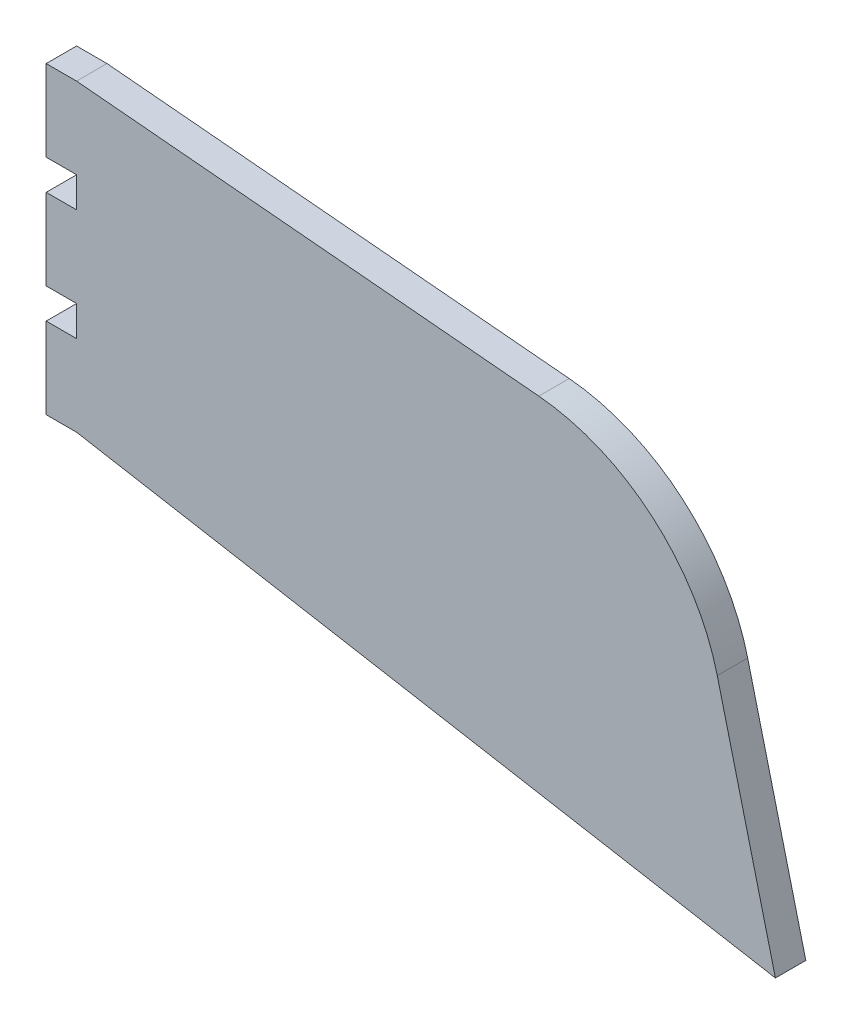
ISO-10303-21;
HEADER;
FILE_DESCRIPTION(('STEP AP214'),'2;1');
FILE_NAME('part.step','',(''),(''),'','','');
FILE_SCHEMA(('AUTOMOTIVE_DESIGN { 1 0 10303 214 1 1 1 1 }'));
ENDSEC;
DATA;
#1=APPLICATION_CONTEXT('core data for automotive mechanical design processes');
#2=APPLICATION_PROTOCOL_DEFINITION('international standard','automotive_design',2000,#1);
#3=PRODUCT_CONTEXT('',#1,'mechanical');
#4=PRODUCT('Part','Part','',(#3));
#5=PRODUCT_RELATED_PRODUCT_CATEGORY('part','',(#4));
#6=PRODUCT_DEFINITION_FORMATION('','',#4);
#7=PRODUCT_DEFINITION_CONTEXT('part definition',#1,'design');
#8=PRODUCT_DEFINITION('design','',#6,#7);
#9=PRODUCT_DEFINITION_SHAPE('','',#8);
#10=(LENGTH_UNIT() NAMED_UNIT(*) SI_UNIT(.MILLI.,.METRE.));
#11=(NAMED_UNIT(*) PLANE_ANGLE_UNIT() SI_UNIT($,.RADIAN.));
#12=(NAMED_UNIT(*) SI_UNIT($,.STERADIAN.) SOLID_ANGLE_UNIT());
#13=UNCERTAINTY_MEASURE_WITH_UNIT(LENGTH_MEASURE(1.E-05),#10,'distance_accuracy_value','');
#14=(GEOMETRIC_REPRESENTATION_CONTEXT(3) GLOBAL_UNCERTAINTY_ASSIGNED_CONTEXT((#13)) GLOBAL_UNIT_ASSIGNED_CONTEXT((#10,
#11,#12)) REPRESENTATION_CONTEXT('',''));
#15=CARTESIAN_POINT('',(0.,0.,0.));
#16=DIRECTION('',(0.,0.,1.));
#17=DIRECTION('',(1.,0.,0.));
#18=AXIS2_PLACEMENT_3D('',#15,#16,#17);
#19=CARTESIAN_POINT('',(3.21481707883157,35.6487339708589,3.));
#20=DIRECTION('',(0.0898159250307489,0.995958382469303,0.));
#21=DIRECTION('',(-0.995958382469303,0.0898159250307489,0.));
#22=AXIS2_PLACEMENT_3D('',#19,#20,#21);
#23=PLANE('',#22);
#24=DIRECTION('',(0.995958382469303,-0.0898159250307489,0.));
#25=VECTOR('',#24,1.);
#26=CARTESIAN_POINT('',(3.21481707883157,35.6487339708589,3.));
#27=LINE('',#26,#25);
#28=CARTESIAN_POINT('',(-68.9365427108545,42.1553724366853,3.));
#29=VERTEX_POINT('',#28);
#30=CARTESIAN_POINT('',(-23.3424878666364,38.0436823461987,3.));
#31=VERTEX_POINT('',#30);
#32=EDGE_CURVE('E146',#29,#31,#27,.T.);
#33=ORIENTED_EDGE('',*,*,#32,.T.);
#34=DIRECTION('',(0.,0.,-1.));
#35=VECTOR('',#34,1.);
#36=CARTESIAN_POINT('',(-23.3424878666364,38.0436823461987,3.));
#37=LINE('',#36,#35);
#38=CARTESIAN_POINT('',(-23.3424878666364,38.0436823461987,0.));
#39=VERTEX_POINT('',#38);
#40=EDGE_CURVE('E151',#31,#39,#37,.T.);
#41=ORIENTED_EDGE('',*,*,#40,.T.);
#42=DIRECTION('',(0.995958382469303,-0.0898159250307489,0.));
#43=VECTOR('',#42,1.);
#44=CARTESIAN_POINT('',(3.21481707883157,35.6487339708589,0.));
#45=LINE('',#44,#43);
#46=CARTESIAN_POINT('',(-68.9365427108545,42.1553724366853,0.));
#47=VERTEX_POINT('',#46);
#48=EDGE_CURVE('E148',#47,#39,#45,.T.);
#49=ORIENTED_EDGE('',*,*,#48,.F.);
#50=DIRECTION('',(0.,0.,-1.));
#51=VECTOR('',#50,1.);
#52=CARTESIAN_POINT('',(-68.9365427108545,42.1553724366853,3.));
#53=LINE('',#52,#51);
#54=EDGE_CURVE('E142',#29,#47,#53,.T.);
#55=ORIENTED_EDGE('',*,*,#54,.F.);
#56=EDGE_LOOP('',(#33,#41,#49,#55));
#57=FACE_BOUND('',#56,.T.);
#58=ADVANCED_FACE('F37',(#57),#23,.T.);
#59=CARTESIAN_POINT('',(0.,42.1553724366855,3.));
#60=DIRECTION('',(0.,-1.,0.));
#61=DIRECTION('',(1.,0.,0.));
#62=AXIS2_PLACEMENT_3D('',#59,#60,#61);
#63=PLANE('',#62);
#64=DIRECTION('',(-1.,0.,0.));
#65=VECTOR('',#64,1.);
#66=CARTESIAN_POINT('',(0.,42.1553724366855,0.));
#67=LINE('',#66,#65);
#68=CARTESIAN_POINT('',(-71.9365427108545,42.1553724366853,0.));
#69=VERTEX_POINT('',#68);
#70=EDGE_CURVE('E198',#47,#69,#67,.T.);
#71=ORIENTED_EDGE('',*,*,#70,.T.);
#72=DIRECTION('',(0.,0.,-1.));
#73=VECTOR('',#72,1.);
#74=CARTESIAN_POINT('',(-71.9365427108545,42.1553724366853,3.));
#75=LINE('',#74,#73);
#76=CARTESIAN_POINT('',(-71.9365427108545,42.1553724366853,3.));
#77=VERTEX_POINT('',#76);
#78=EDGE_CURVE('E152',#77,#69,#75,.T.);
#79=ORIENTED_EDGE('',*,*,#78,.F.);
#80=DIRECTION('',(-1.,0.,0.));
#81=VECTOR('',#80,1.);
#82=CARTESIAN_POINT('',(0.,42.1553724366855,3.));
#83=LINE('',#82,#81);
#84=EDGE_CURVE('E155',#29,#77,#83,.T.);
#85=ORIENTED_EDGE('',*,*,#84,.F.);
#86=ORIENTED_EDGE('',*,*,#54,.T.);
#87=EDGE_LOOP('',(#71,#79,#85,#86));
#88=FACE_BOUND('',#87,.T.);
#89=ADVANCED_FACE('F156',(#88),#63,.F.);
#90=CARTESIAN_POINT('',(-71.9365427108545,0.,3.));
#91=DIRECTION('',(1.,0.,0.));
#92=DIRECTION('',(0.,0.,-1.));
#93=AXIS2_PLACEMENT_3D('',#90,#91,#92);
#94=PLANE('',#93);
#95=DIRECTION('',(0.,-1.,0.));
#96=VECTOR('',#95,1.);
#97=CARTESIAN_POINT('',(-71.9365427108545,0.,0.));
#98=LINE('',#97,#96);
#99=CARTESIAN_POINT('',(-71.9365427108545,34.1553724366853,0.));
#100=VERTEX_POINT('',#99);
#101=EDGE_CURVE('E200',#69,#100,#98,.T.);
#102=ORIENTED_EDGE('',*,*,#101,.T.);
#103=DIRECTION('',(0.,0.,-1.));
#104=VECTOR('',#103,1.);
#105=CARTESIAN_POINT('',(-71.9365427108545,34.1553724366853,3.));
#106=LINE('',#105,#104);
#107=CARTESIAN_POINT('',(-71.9365427108545,34.1553724366853,3.));
#108=VERTEX_POINT('',#107);
#109=EDGE_CURVE('E251',#108,#100,#106,.T.);
#110=ORIENTED_EDGE('',*,*,#109,.F.);
#111=DIRECTION('',(0.,-1.,0.));
#112=VECTOR('',#111,1.);
#113=CARTESIAN_POINT('',(-71.9365427108545,0.,3.));
#114=LINE('',#113,#112);
#115=EDGE_CURVE('E160',#77,#108,#114,.T.);
#116=ORIENTED_EDGE('',*,*,#115,.F.);
#117=ORIENTED_EDGE('',*,*,#78,.T.);
#118=EDGE_LOOP('',(#102,#110,#116,#117));
#119=FACE_BOUND('',#118,.T.);
#120=ADVANCED_FACE('F259',(#119),#94,.F.);
#121=CARTESIAN_POINT('',(0.,34.1553724366853,3.));
#122=DIRECTION('',(0.,-1.,0.));
#123=DIRECTION('',(0.,0.,-1.));
#124=AXIS2_PLACEMENT_3D('',#121,#122,#123);
#125=PLANE('',#124);
#126=DIRECTION('',(-1.,0.,0.));
#127=VECTOR('',#126,1.);
#128=CARTESIAN_POINT('',(0.,34.1553724366853,0.));
#129=LINE('',#128,#127);
#130=CARTESIAN_POINT('',(-68.9365427108545,34.1553724366853,0.));
#131=VERTEX_POINT('',#130);
#132=EDGE_CURVE('E203',#131,#100,#129,.T.);
#133=ORIENTED_EDGE('',*,*,#132,.F.);
#134=DIRECTION('',(0.,0.,-1.));
#135=VECTOR('',#134,1.);
#136=CARTESIAN_POINT('',(-68.9365427108545,34.1553724366853,3.));
#137=LINE('',#136,#135);
#138=CARTESIAN_POINT('',(-68.9365427108545,34.1553724366853,3.));
#139=VERTEX_POINT('',#138);
#140=EDGE_CURVE('E249',#139,#131,#137,.T.);
#141=ORIENTED_EDGE('',*,*,#140,.F.);
#142=DIRECTION('',(-1.,0.,0.));
#143=VECTOR('',#142,1.);
#144=CARTESIAN_POINT('',(0.,34.1553724366853,3.));
#145=LINE('',#144,#143);
#146=EDGE_CURVE('E170',#139,#108,#145,.T.);
#147=ORIENTED_EDGE('',*,*,#146,.T.);
#148=ORIENTED_EDGE('',*,*,#109,.T.);
#149=EDGE_LOOP('',(#133,#141,#147,#148));
#150=FACE_BOUND('',#149,.T.);
#151=ADVANCED_FACE('F266',(#150),#125,.T.);
#152=CARTESIAN_POINT('',(-68.9365427108545,0.,3.));
#153=DIRECTION('',(1.,0.,0.));
#154=DIRECTION('',(0.,0.,-1.));
#155=AXIS2_PLACEMENT_3D('',#152,#153,#154);
#156=PLANE('',#155);
#157=DIRECTION('',(0.,-1.,0.));
#158=VECTOR('',#157,1.);
#159=CARTESIAN_POINT('',(-68.9365427108545,0.,0.));
#160=LINE('',#159,#158);
#161=CARTESIAN_POINT('',(-68.9365427108545,31.1553724366853,0.));
#162=VERTEX_POINT('',#161);
#163=EDGE_CURVE('E206',#131,#162,#160,.T.);
#164=ORIENTED_EDGE('',*,*,#163,.T.);
#165=DIRECTION('',(0.,0.,-1.));
#166=VECTOR('',#165,1.);
#167=CARTESIAN_POINT('',(-68.9365427108545,31.1553724366853,3.));
#168=LINE('',#167,#166);
#169=CARTESIAN_POINT('',(-68.9365427108545,31.1553724366853,3.));
#170=VERTEX_POINT('',#169);
#171=EDGE_CURVE('E246',#170,#162,#168,.T.);
#172=ORIENTED_EDGE('',*,*,#171,.F.);
#173=DIRECTION('',(0.,-1.,0.));
#174=VECTOR('',#173,1.);
#175=CARTESIAN_POINT('',(-68.9365427108545,0.,3.));
#176=LINE('',#175,#174);
#177=EDGE_CURVE('E173',#139,#170,#176,.T.);
#178=ORIENTED_EDGE('',*,*,#177,.F.);
#179=ORIENTED_EDGE('',*,*,#140,.T.);
#180=EDGE_LOOP('',(#164,#172,#178,#179));
#181=FACE_BOUND('',#180,.T.);
#182=ADVANCED_FACE('F269',(#181),#156,.F.);
#183=CARTESIAN_POINT('',(0.,31.1553724366853,3.));
#184=DIRECTION('',(0.,-1.,0.));
#185=DIRECTION('',(0.,0.,-1.));
#186=AXIS2_PLACEMENT_3D('',#183,#184,#185);
#187=PLANE('',#186);
#188=DIRECTION('',(-1.,0.,0.));
#189=VECTOR('',#188,1.);
#190=CARTESIAN_POINT('',(0.,31.1553724366853,0.));
#191=LINE('',#190,#189);
#192=CARTESIAN_POINT('',(-71.9365427108545,31.1553724366853,0.));
#193=VERTEX_POINT('',#192);
#194=EDGE_CURVE('E208',#162,#193,#191,.T.);
#195=ORIENTED_EDGE('',*,*,#194,.T.);
#196=DIRECTION('',(0.,0.,-1.));
#197=VECTOR('',#196,1.);
#198=CARTESIAN_POINT('',(-71.9365427108545,31.1553724366853,3.));
#199=LINE('',#198,#197);
#200=CARTESIAN_POINT('',(-71.9365427108545,31.1553724366853,3.));
#201=VERTEX_POINT('',#200);
#202=EDGE_CURVE('E243',#201,#193,#199,.T.);
#203=ORIENTED_EDGE('',*,*,#202,.F.);
#204=DIRECTION('',(-1.,0.,0.));
#205=VECTOR('',#204,1.);
#206=CARTESIAN_POINT('',(0.,31.1553724366853,3.));
#207=LINE('',#206,#205);
#208=EDGE_CURVE('E175',#170,#201,#207,.T.);
#209=ORIENTED_EDGE('',*,*,#208,.F.);
#210=ORIENTED_EDGE('',*,*,#171,.T.);
#211=EDGE_LOOP('',(#195,#203,#209,#210));
#212=FACE_BOUND('',#211,.T.);
#213=ADVANCED_FACE('F274',(#212),#187,.F.);
#214=CARTESIAN_POINT('',(-71.9365427108545,0.,3.));
#215=DIRECTION('',(1.,0.,0.));
#216=DIRECTION('',(0.,0.,-1.));
#217=AXIS2_PLACEMENT_3D('',#214,#215,#216);
#218=PLANE('',#217);
#219=DIRECTION('',(0.,-1.,0.));
#220=VECTOR('',#219,1.);
#221=CARTESIAN_POINT('',(-71.9365427108545,0.,0.));
#222=LINE('',#221,#220);
#223=CARTESIAN_POINT('',(-71.9365427108545,23.1553724366853,0.));
#224=VERTEX_POINT('',#223);
#225=EDGE_CURVE('E211',#193,#224,#222,.T.);
#226=ORIENTED_EDGE('',*,*,#225,.T.);
#227=DIRECTION('',(0.,0.,-1.));
#228=VECTOR('',#227,1.);
#229=CARTESIAN_POINT('',(-71.9365427108545,23.1553724366853,3.));
#230=LINE('',#229,#228);
#231=CARTESIAN_POINT('',(-71.9365427108545,23.1553724366853,3.));
#232=VERTEX_POINT('',#231);
#233=EDGE_CURVE('E241',#232,#224,#230,.T.);
#234=ORIENTED_EDGE('',*,*,#233,.F.);
#235=DIRECTION('',(0.,-1.,0.));
#236=VECTOR('',#235,1.);
#237=CARTESIAN_POINT('',(-71.9365427108545,0.,3.));
#238=LINE('',#237,#236);
#239=EDGE_CURVE('E178',#201,#232,#238,.T.);
#240=ORIENTED_EDGE('',*,*,#239,.F.);
#241=ORIENTED_EDGE('',*,*,#202,.T.);
#242=EDGE_LOOP('',(#226,#234,#240,#241));
#243=FACE_BOUND('',#242,.T.);
#244=ADVANCED_FACE('F279',(#243),#218,.F.);
#245=CARTESIAN_POINT('',(0.,23.1553724366854,3.));
#246=DIRECTION('',(0.,-1.,0.));
#247=DIRECTION('',(1.,0.,0.));
#248=AXIS2_PLACEMENT_3D('',#245,#246,#247);
#249=PLANE('',#248);
#250=DIRECTION('',(-1.,0.,0.));
#251=VECTOR('',#250,1.);
#252=CARTESIAN_POINT('',(0.,23.1553724366854,0.));
#253=LINE('',#252,#251);
#254=CARTESIAN_POINT('',(-68.9365427108545,23.1553724366853,0.));
#255=VERTEX_POINT('',#254);
#256=EDGE_CURVE('E214',#255,#224,#253,.T.);
#257=ORIENTED_EDGE('',*,*,#256,.F.);
#258=DIRECTION('',(0.,0.,-1.));
#259=VECTOR('',#258,1.);
#260=CARTESIAN_POINT('',(-68.9365427108545,23.1553724366853,3.));
#261=LINE('',#260,#259);
#262=CARTESIAN_POINT('',(-68.9365427108545,23.1553724366853,3.));
#263=VERTEX_POINT('',#262);
#264=EDGE_CURVE('E239',#263,#255,#261,.T.);
#265=ORIENTED_EDGE('',*,*,#264,.F.);
#266=DIRECTION('',(-1.,0.,0.));
#267=VECTOR('',#266,1.);
#268=CARTESIAN_POINT('',(0.,23.1553724366854,3.));
#269=LINE('',#268,#267);
#270=EDGE_CURVE('E180',#263,#232,#269,.T.);
#271=ORIENTED_EDGE('',*,*,#270,.T.);
#272=ORIENTED_EDGE('',*,*,#233,.T.);
#273=EDGE_LOOP('',(#257,#265,#271,#272));
#274=FACE_BOUND('',#273,.T.);
#275=ADVANCED_FACE('F283',(#274),#249,.T.);
#276=CARTESIAN_POINT('',(-68.9365427108545,20.1553724366853,0.));
#277=VERTEX_POINT('',#276);
#278=EDGE_CURVE('E209',#255,#277,#160,.T.);
#279=ORIENTED_EDGE('',*,*,#278,.T.);
#280=DIRECTION('',(0.,0.,-1.));
#281=VECTOR('',#280,1.);
#282=CARTESIAN_POINT('',(-68.9365427108545,20.1553724366853,3.));
#283=LINE('',#282,#281);
#284=CARTESIAN_POINT('',(-68.9365427108545,20.1553724366853,3.));
#285=VERTEX_POINT('',#284);
#286=EDGE_CURVE('E236',#285,#277,#283,.T.);
#287=ORIENTED_EDGE('',*,*,#286,.F.);
#288=EDGE_CURVE('E176',#263,#285,#176,.T.);
#289=ORIENTED_EDGE('',*,*,#288,.F.);
#290=ORIENTED_EDGE('',*,*,#264,.T.);
#291=EDGE_LOOP('',(#279,#287,#289,#290));
#292=FACE_BOUND('',#291,.T.);
#293=ADVANCED_FACE('F288',(#292),#156,.F.);
#294=CARTESIAN_POINT('',(0.,20.1553724366854,3.));
#295=DIRECTION('',(0.,-1.,0.));
#296=DIRECTION('',(1.,0.,0.));
#297=AXIS2_PLACEMENT_3D('',#294,#295,#296);
#298=PLANE('',#297);
#299=DIRECTION('',(-1.,0.,0.));
#300=VECTOR('',#299,1.);
#301=CARTESIAN_POINT('',(0.,20.1553724366854,0.));
#302=LINE('',#301,#300);
#303=CARTESIAN_POINT('',(-71.9365427108545,20.1553724366853,0.));
#304=VERTEX_POINT('',#303);
#305=EDGE_CURVE('E217',#277,#304,#302,.T.);
#306=ORIENTED_EDGE('',*,*,#305,.T.);
#307=DIRECTION('',(0.,0.,-1.));
#308=VECTOR('',#307,1.);
#309=CARTESIAN_POINT('',(-71.9365427108545,20.1553724366853,3.));
#310=LINE('',#309,#308);
#311=CARTESIAN_POINT('',(-71.9365427108545,20.1553724366853,3.));
#312=VERTEX_POINT('',#311);
#313=EDGE_CURVE('E234',#312,#304,#310,.T.);
#314=ORIENTED_EDGE('',*,*,#313,.F.);
#315=DIRECTION('',(-1.,0.,0.));
#316=VECTOR('',#315,1.);
#317=CARTESIAN_POINT('',(0.,20.1553724366854,3.));
#318=LINE('',#317,#316);
#319=EDGE_CURVE('E183',#285,#312,#318,.T.);
#320=ORIENTED_EDGE('',*,*,#319,.F.);
#321=ORIENTED_EDGE('',*,*,#286,.T.);
#322=EDGE_LOOP('',(#306,#314,#320,#321));
#323=FACE_BOUND('',#322,.T.);
#324=ADVANCED_FACE('F294',(#323),#298,.F.);
#325=CARTESIAN_POINT('',(-71.9365427108545,0.,3.));
#326=DIRECTION('',(-1.,0.,0.));
#327=DIRECTION('',(0.,0.,1.));
#328=AXIS2_PLACEMENT_3D('',#325,#326,#327);
#329=PLANE('',#328);
#330=DIRECTION('',(0.,1.,0.));
#331=VECTOR('',#330,1.);
#332=CARTESIAN_POINT('',(-71.9365427108545,0.,0.));
#333=LINE('',#332,#331);
#334=CARTESIAN_POINT('',(-71.9365427108545,12.1553724366853,0.));
#335=VERTEX_POINT('',#334);
#336=EDGE_CURVE('E220',#335,#304,#333,.T.);
#337=ORIENTED_EDGE('',*,*,#336,.F.);
#338=DIRECTION('',(0.,0.,-1.));
#339=VECTOR('',#338,1.);
#340=CARTESIAN_POINT('',(-71.9365427108545,12.1553724366853,3.));
#341=LINE('',#340,#339);
#342=CARTESIAN_POINT('',(-71.9365427108545,12.1553724366853,3.));
#343=VERTEX_POINT('',#342);
#344=EDGE_CURVE('E232',#343,#335,#341,.T.);
#345=ORIENTED_EDGE('',*,*,#344,.F.);
#346=DIRECTION('',(0.,1.,0.));
#347=VECTOR('',#346,1.);
#348=CARTESIAN_POINT('',(-71.9365427108545,0.,3.));
#349=LINE('',#348,#347);
#350=EDGE_CURVE('E185',#343,#312,#349,.T.);
#351=ORIENTED_EDGE('',*,*,#350,.T.);
#352=ORIENTED_EDGE('',*,*,#313,.T.);
#353=EDGE_LOOP('',(#337,#345,#351,#352));
#354=FACE_BOUND('',#353,.T.);
#355=ADVANCED_FACE('F298',(#354),#329,.T.);
#356=CARTESIAN_POINT('',(0.,12.1553724366855,3.));
#357=DIRECTION('',(0.,-1.,0.));
#358=DIRECTION('',(1.,0.,0.));
#359=AXIS2_PLACEMENT_3D('',#356,#357,#358);
#360=PLANE('',#359);
#361=DIRECTION('',(-1.,0.,0.));
#362=VECTOR('',#361,1.);
#363=CARTESIAN_POINT('',(0.,12.1553724366855,0.));
#364=LINE('',#363,#362);
#365=CARTESIAN_POINT('',(-68.9365427108545,12.1553724366853,0.));
#366=VERTEX_POINT('',#365);
#367=EDGE_CURVE('E223',#366,#335,#364,.T.);
#368=ORIENTED_EDGE('',*,*,#367,.F.);
#369=DIRECTION('',(0.,0.,-1.));
#370=VECTOR('',#369,1.);
#371=CARTESIAN_POINT('',(-68.9365427108545,12.1553724366853,3.));
#372=LINE('',#371,#370);
#373=CARTESIAN_POINT('',(-68.9365427108545,12.1553724366853,3.));
#374=VERTEX_POINT('',#373);
#375=EDGE_CURVE('E230',#374,#366,#372,.T.);
#376=ORIENTED_EDGE('',*,*,#375,.F.);
#377=DIRECTION('',(-1.,0.,0.));
#378=VECTOR('',#377,1.);
#379=CARTESIAN_POINT('',(0.,12.1553724366855,3.));
#380=LINE('',#379,#378);
#381=EDGE_CURVE('E188',#374,#343,#380,.T.);
#382=ORIENTED_EDGE('',*,*,#381,.T.);
#383=ORIENTED_EDGE('',*,*,#344,.T.);
#384=EDGE_LOOP('',(#368,#376,#382,#383));
#385=FACE_BOUND('',#384,.T.);
#386=ADVANCED_FACE('F301',(#385),#360,.T.);
#387=CARTESIAN_POINT('',(0.,0.,3.));
#388=DIRECTION('',(0.173648177666933,0.984807753012207,0.));
#389=DIRECTION('',(-0.984807753012208,0.173648177666933,0.));
#390=AXIS2_PLACEMENT_3D('',#387,#388,#389);
#391=PLANE('',#390);
#392=DIRECTION('',(0.984807753012208,-0.173648177666933,0.));
#393=VECTOR('',#392,1.);
#394=CARTESIAN_POINT('',(0.,0.,0.));
#395=LINE('',#394,#393);
#396=CARTESIAN_POINT('',(0.,0.,0.));
#397=VERTEX_POINT('',#396);
#398=EDGE_CURVE('E166',#366,#397,#395,.T.);
#399=ORIENTED_EDGE('',*,*,#398,.T.);
#400=DIRECTION('',(0.,0.,-1.));
#401=VECTOR('',#400,1.);
#402=CARTESIAN_POINT('',(0.,0.,3.));
#403=LINE('',#402,#401);
#404=CARTESIAN_POINT('',(0.,0.,3.));
#405=VERTEX_POINT('',#404);
#406=EDGE_CURVE('E196',#405,#397,#403,.T.);
#407=ORIENTED_EDGE('',*,*,#406,.F.);
#408=DIRECTION('',(0.984807753012208,-0.173648177666933,0.));
#409=VECTOR('',#408,1.);
#410=CARTESIAN_POINT('',(0.,0.,3.));
#411=LINE('',#410,#409);
#412=EDGE_CURVE('E191',#374,#405,#411,.T.);
#413=ORIENTED_EDGE('',*,*,#412,.F.);
#414=ORIENTED_EDGE('',*,*,#375,.T.);
#415=EDGE_LOOP('',(#399,#407,#413,#414));
#416=FACE_BOUND('',#415,.T.);
#417=ADVANCED_FACE('F305',(#416),#391,.F.);
#418=CARTESIAN_POINT('',(0.,0.,3.));
#419=DIRECTION('',(0.970220464290268,0.242223555155926,0.));
#420=DIRECTION('',(-0.242223555155926,0.970220464290269,0.));
#421=AXIS2_PLACEMENT_3D('',#418,#419,#420);
#422=PLANE('',#421);
#423=DIRECTION('',(0.242223555155926,-0.970220464290269,0.));
#424=VECTOR('',#423,1.);
#425=CARTESIAN_POINT('',(0.,0.,0.));
#426=LINE('',#425,#424);
#427=CARTESIAN_POINT('',(-5.734397081446,22.9689857999312,0.));
#428=VERTEX_POINT('',#427);
#429=EDGE_CURVE('E164',#428,#397,#426,.T.);
#430=ORIENTED_EDGE('',*,*,#429,.F.);
#431=DIRECTION('',(0.,0.,-1.));
#432=VECTOR('',#431,1.);
#433=CARTESIAN_POINT('',(-5.734397081446,22.9689857999311,3.));
#434=LINE('',#433,#432);
#435=CARTESIAN_POINT('',(-5.734397081446,22.9689857999312,3.));
#436=VERTEX_POINT('',#435);
#437=EDGE_CURVE('E45',#428,#436,#434,.F.);
#438=ORIENTED_EDGE('',*,*,#437,.T.);
#439=DIRECTION('',(0.242223555155926,-0.970220464290269,0.));
#440=VECTOR('',#439,1.);
#441=CARTESIAN_POINT('',(0.,0.,3.));
#442=LINE('',#441,#440);
#443=EDGE_CURVE('E194',#436,#405,#442,.T.);
#444=ORIENTED_EDGE('',*,*,#443,.T.);
#445=ORIENTED_EDGE('',*,*,#406,.T.);
#446=EDGE_LOOP('',(#430,#438,#444,#445));
#447=FACE_BOUND('',#446,.T.);
#448=ADVANCED_FACE('F307',(#447),#422,.T.);
#449=CARTESIAN_POINT('',(0.,0.,3.));
#450=DIRECTION('',(0.,0.,1.));
#451=DIRECTION('',(1.,0.,0.));
#452=AXIS2_PLACEMENT_3D('',#449,#450,#451);
#453=PLANE('',#452);
#454=ORIENTED_EDGE('',*,*,#443,.F.);
#455=CARTESIAN_POINT('',(-25.1388063672514,18.1245146968126,3.));
#456=DIRECTION('',(0.,0.,1.));
#457=DIRECTION('',(1.,0.,0.));
#458=AXIS2_PLACEMENT_3D('',#455,#456,#457);
#459=CIRCLE('',#458,20.);
#460=EDGE_CURVE('E11',#436,#31,#459,.T.);
#461=ORIENTED_EDGE('',*,*,#460,.T.);
#462=ORIENTED_EDGE('',*,*,#32,.F.);
#463=ORIENTED_EDGE('',*,*,#84,.T.);
#464=ORIENTED_EDGE('',*,*,#115,.T.);
#465=ORIENTED_EDGE('',*,*,#146,.F.);
#466=ORIENTED_EDGE('',*,*,#177,.T.);
#467=ORIENTED_EDGE('',*,*,#208,.T.);
#468=ORIENTED_EDGE('',*,*,#239,.T.);
#469=ORIENTED_EDGE('',*,*,#270,.F.);
#470=ORIENTED_EDGE('',*,*,#288,.T.);
#471=ORIENTED_EDGE('',*,*,#319,.T.);
#472=ORIENTED_EDGE('',*,*,#350,.F.);
#473=ORIENTED_EDGE('',*,*,#381,.F.);
#474=ORIENTED_EDGE('',*,*,#412,.T.);
#475=EDGE_LOOP('',(#454,#461,#462,#463,#464,#465,#466,#467,#468,#469,#470,#471,#472,#473,#474));
#476=FACE_BOUND('',#475,.T.);
#477=ADVANCED_FACE('F162',(#476),#453,.T.);
#478=CARTESIAN_POINT('',(0.,0.,0.));
#479=DIRECTION('',(0.,0.,1.));
#480=DIRECTION('',(1.,0.,0.));
#481=AXIS2_PLACEMENT_3D('',#478,#479,#480);
#482=PLANE('',#481);
#483=ORIENTED_EDGE('',*,*,#48,.T.);
#484=CARTESIAN_POINT('',(-25.1388063672514,18.1245146968126,0.));
#485=DIRECTION('',(0.,0.,1.));
#486=DIRECTION('',(1.,0.,0.));
#487=AXIS2_PLACEMENT_3D('',#484,#485,#486);
#488=CIRCLE('',#487,20.);
#489=EDGE_CURVE('E59',#39,#428,#488,.F.);
#490=ORIENTED_EDGE('',*,*,#489,.T.);
#491=ORIENTED_EDGE('',*,*,#429,.T.);
#492=ORIENTED_EDGE('',*,*,#398,.F.);
#493=ORIENTED_EDGE('',*,*,#367,.T.);
#494=ORIENTED_EDGE('',*,*,#336,.T.);
#495=ORIENTED_EDGE('',*,*,#305,.F.);
#496=ORIENTED_EDGE('',*,*,#278,.F.);
#497=ORIENTED_EDGE('',*,*,#256,.T.);
#498=ORIENTED_EDGE('',*,*,#225,.F.);
#499=ORIENTED_EDGE('',*,*,#194,.F.);
#500=ORIENTED_EDGE('',*,*,#163,.F.);
#501=ORIENTED_EDGE('',*,*,#132,.T.);
#502=ORIENTED_EDGE('',*,*,#101,.F.);
#503=ORIENTED_EDGE('',*,*,#70,.F.);
#504=EDGE_LOOP('',(#483,#490,#491,#492,#493,#494,#495,#496,#497,#498,#499,#500,#501,#502,#503));
#505=FACE_BOUND('',#504,.T.);
#506=ADVANCED_FACE('F256',(#505),#482,.F.);
#507=CARTESIAN_POINT('',(-25.1388063672514,18.1245146968126,3.));
#508=DIRECTION('',(0.,0.,-1.));
#509=DIRECTION('',(-1.,0.,0.));
#510=AXIS2_PLACEMENT_3D('',#507,#508,#509);
#511=CYLINDRICAL_SURFACE('',#510,20.);
#512=ORIENTED_EDGE('',*,*,#460,.F.);
#513=ORIENTED_EDGE('',*,*,#437,.F.);
#514=ORIENTED_EDGE('',*,*,#489,.F.);
#515=ORIENTED_EDGE('',*,*,#40,.F.);
#516=EDGE_LOOP('',(#512,#513,#514,#515));
#517=FACE_BOUND('',#516,.T.);
#518=ADVANCED_FACE('F39',(#517),#511,.T.);
#519=CLOSED_SHELL('',(#58,#89,#120,#151,#182,#213,#244,#275,#293,#324,#355,#386,#417,#448,#477,
#506,#518));
#520=MANIFOLD_SOLID_BREP('B2',#519);
#521=ADVANCED_BREP_SHAPE_REPRESENTATION('',(#18,#520),#14);
#522=SHAPE_DEFINITION_REPRESENTATION(#9,#521);
ENDSEC;
END-ISO-10303-21;
